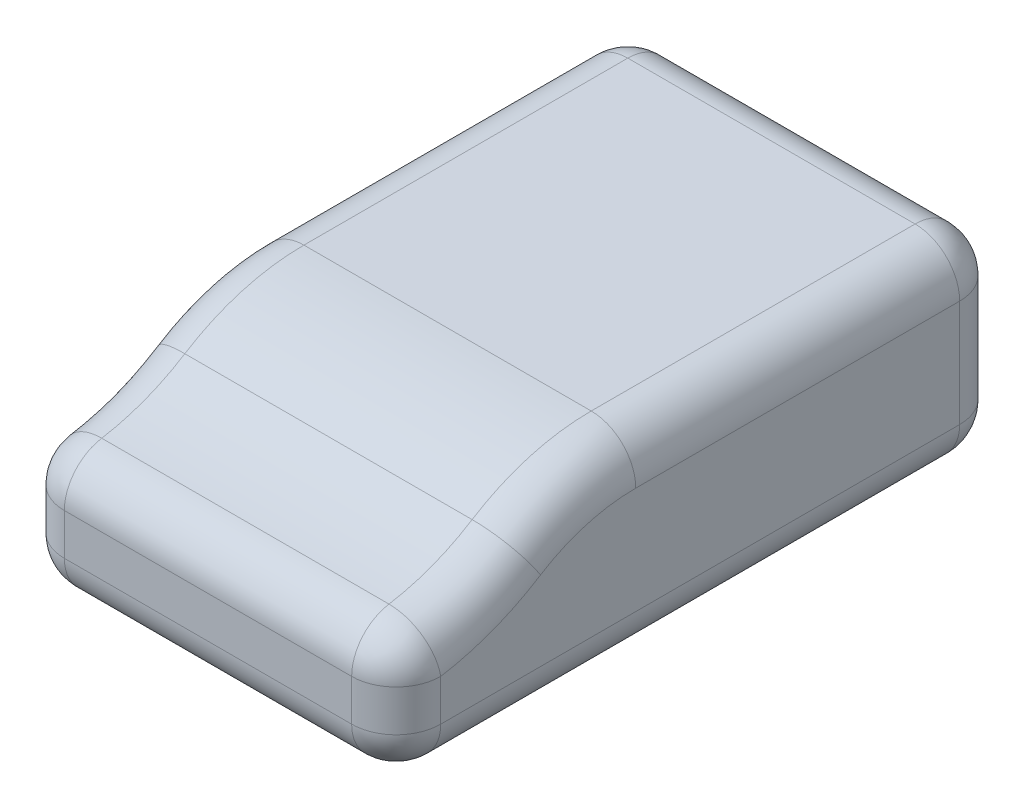
ISO-10303-21;
HEADER;
FILE_DESCRIPTION(('STEP AP214'),'2;1');
FILE_NAME('part.step','',(''),(''),'','','');
FILE_SCHEMA(('AUTOMOTIVE_DESIGN { 1 0 10303 214 1 1 1 1 }'));
ENDSEC;
DATA;
#1=APPLICATION_CONTEXT('core data for automotive mechanical design processes');
#2=APPLICATION_PROTOCOL_DEFINITION('international standard','automotive_design',2000,#1);
#3=PRODUCT_CONTEXT('',#1,'mechanical');
#4=PRODUCT('Part','Part','',(#3));
#5=PRODUCT_RELATED_PRODUCT_CATEGORY('part','',(#4));
#6=PRODUCT_DEFINITION_FORMATION('','',#4);
#7=PRODUCT_DEFINITION_CONTEXT('part definition',#1,'design');
#8=PRODUCT_DEFINITION('design','',#6,#7);
#9=PRODUCT_DEFINITION_SHAPE('','',#8);
#10=(LENGTH_UNIT() NAMED_UNIT(*) SI_UNIT(.MILLI.,.METRE.));
#11=(NAMED_UNIT(*) PLANE_ANGLE_UNIT() SI_UNIT($,.RADIAN.));
#12=(NAMED_UNIT(*) SI_UNIT($,.STERADIAN.) SOLID_ANGLE_UNIT());
#13=UNCERTAINTY_MEASURE_WITH_UNIT(LENGTH_MEASURE(1.E-05),#10,'distance_accuracy_value','');
#14=(GEOMETRIC_REPRESENTATION_CONTEXT(3) GLOBAL_UNCERTAINTY_ASSIGNED_CONTEXT((#13)) GLOBAL_UNIT_ASSIGNED_CONTEXT((#10,
#11,#12)) REPRESENTATION_CONTEXT('',''));
#15=CARTESIAN_POINT('',(0.,0.,0.));
#16=DIRECTION('',(0.,0.,1.));
#17=DIRECTION('',(1.,0.,0.));
#18=AXIS2_PLACEMENT_3D('',#15,#16,#17);
#19=CARTESIAN_POINT('',(8.45,1.3,13.65));
#20=DIRECTION('',(0.,0.,-1.));
#21=DIRECTION('',(-1.,0.,0.));
#22=AXIS2_PLACEMENT_3D('',#19,#20,#21);
#23=PLANE('',#22);
#24=DIRECTION('',(0.,-1.,0.));
#25=VECTOR('',#24,1.);
#26=CARTESIAN_POINT('',(6.45,1.3,13.65));
#27=LINE('',#26,#25);
#28=CARTESIAN_POINT('',(6.45,-2.4,13.65));
#29=VERTEX_POINT('',#28);
#30=CARTESIAN_POINT('',(6.45,-0.542457216295852,13.65));
#31=VERTEX_POINT('',#30);
#32=EDGE_CURVE('E201',#29,#31,#27,.F.);
#33=ORIENTED_EDGE('',*,*,#32,.T.);
#34=DIRECTION('',(-1.,0.,0.));
#35=VECTOR('',#34,1.);
#36=CARTESIAN_POINT('',(8.45,-0.542457216295852,13.65));
#37=LINE('',#36,#35);
#38=CARTESIAN_POINT('',(-6.45,-0.542457216295852,13.65));
#39=VERTEX_POINT('',#38);
#40=EDGE_CURVE('E47',#31,#39,#37,.T.);
#41=ORIENTED_EDGE('',*,*,#40,.T.);
#42=DIRECTION('',(0.,-1.,0.));
#43=VECTOR('',#42,1.);
#44=CARTESIAN_POINT('',(-6.45,1.3,13.65));
#45=LINE('',#44,#43);
#46=CARTESIAN_POINT('',(-6.45,-2.4,13.65));
#47=VERTEX_POINT('',#46);
#48=EDGE_CURVE('E206',#39,#47,#45,.T.);
#49=ORIENTED_EDGE('',*,*,#48,.T.);
#50=DIRECTION('',(-1.,0.,0.));
#51=VECTOR('',#50,1.);
#52=CARTESIAN_POINT('',(8.45,-2.4,13.65));
#53=LINE('',#52,#51);
#54=EDGE_CURVE('E203',#47,#29,#53,.F.);
#55=ORIENTED_EDGE('',*,*,#54,.T.);
#56=EDGE_LOOP('',(#33,#41,#49,#55));
#57=FACE_BOUND('',#56,.T.);
#58=ADVANCED_FACE('F38',(#57),#23,.F.);
#59=CARTESIAN_POINT('',(8.45,-4.4,13.65));
#60=DIRECTION('',(0.,1.,0.));
#61=DIRECTION('',(0.,0.,1.));
#62=AXIS2_PLACEMENT_3D('',#59,#60,#61);
#63=PLANE('',#62);
#64=DIRECTION('',(-1.,0.,0.));
#65=VECTOR('',#64,1.);
#66=CARTESIAN_POINT('',(8.45,-4.4,11.65));
#67=LINE('',#66,#65);
#68=CARTESIAN_POINT('',(6.45,-4.4,11.65));
#69=VERTEX_POINT('',#68);
#70=CARTESIAN_POINT('',(-6.45,-4.4,11.65));
#71=VERTEX_POINT('',#70);
#72=EDGE_CURVE('E165',#69,#71,#67,.T.);
#73=ORIENTED_EDGE('',*,*,#72,.T.);
#74=DIRECTION('',(0.,0.,-1.));
#75=VECTOR('',#74,1.);
#76=CARTESIAN_POINT('',(-6.45,-4.4,13.65));
#77=LINE('',#76,#75);
#78=CARTESIAN_POINT('',(-6.45,-4.4,-11.65));
#79=VERTEX_POINT('',#78);
#80=EDGE_CURVE('E161',#71,#79,#77,.T.);
#81=ORIENTED_EDGE('',*,*,#80,.T.);
#82=DIRECTION('',(-1.,0.,0.));
#83=VECTOR('',#82,1.);
#84=CARTESIAN_POINT('',(8.45,-4.4,-11.65));
#85=LINE('',#84,#83);
#86=CARTESIAN_POINT('',(6.45,-4.4,-11.65));
#87=VERTEX_POINT('',#86);
#88=EDGE_CURVE('E153',#79,#87,#85,.F.);
#89=ORIENTED_EDGE('',*,*,#88,.T.);
#90=DIRECTION('',(0.,0.,-1.));
#91=VECTOR('',#90,1.);
#92=CARTESIAN_POINT('',(6.45,-4.4,13.65));
#93=LINE('',#92,#91);
#94=EDGE_CURVE('E158',#87,#69,#93,.F.);
#95=ORIENTED_EDGE('',*,*,#94,.T.);
#96=EDGE_LOOP('',(#73,#81,#89,#95));
#97=FACE_BOUND('',#96,.T.);
#98=ADVANCED_FACE('F156',(#97),#63,.F.);
#99=CARTESIAN_POINT('',(8.45,-4.4,-13.65));
#100=DIRECTION('',(0.,0.,1.));
#101=DIRECTION('',(1.,0.,0.));
#102=AXIS2_PLACEMENT_3D('',#99,#100,#101);
#103=PLANE('',#102);
#104=DIRECTION('',(-1.,0.,0.));
#105=VECTOR('',#104,1.);
#106=CARTESIAN_POINT('',(8.45,-2.4,-13.65));
#107=LINE('',#106,#105);
#108=CARTESIAN_POINT('',(6.45,-2.4,-13.65));
#109=VERTEX_POINT('',#108);
#110=CARTESIAN_POINT('',(-6.45,-2.4,-13.65));
#111=VERTEX_POINT('',#110);
#112=EDGE_CURVE('E173',#109,#111,#107,.T.);
#113=ORIENTED_EDGE('',*,*,#112,.T.);
#114=DIRECTION('',(0.,1.,0.));
#115=VECTOR('',#114,1.);
#116=CARTESIAN_POINT('',(-6.45,-4.4,-13.65));
#117=LINE('',#116,#115);
#118=CARTESIAN_POINT('',(-6.45,2.4,-13.65));
#119=VERTEX_POINT('',#118);
#120=EDGE_CURVE('E213',#111,#119,#117,.T.);
#121=ORIENTED_EDGE('',*,*,#120,.T.);
#122=DIRECTION('',(-1.,0.,0.));
#123=VECTOR('',#122,1.);
#124=CARTESIAN_POINT('',(8.45,2.4,-13.65));
#125=LINE('',#124,#123);
#126=CARTESIAN_POINT('',(6.45,2.4,-13.65));
#127=VERTEX_POINT('',#126);
#128=EDGE_CURVE('E210',#119,#127,#125,.F.);
#129=ORIENTED_EDGE('',*,*,#128,.T.);
#130=DIRECTION('',(0.,1.,0.));
#131=VECTOR('',#130,1.);
#132=CARTESIAN_POINT('',(6.45,-4.4,-13.65));
#133=LINE('',#132,#131);
#134=EDGE_CURVE('E208',#127,#109,#133,.F.);
#135=ORIENTED_EDGE('',*,*,#134,.T.);
#136=EDGE_LOOP('',(#113,#121,#129,#135));
#137=FACE_BOUND('',#136,.T.);
#138=ADVANCED_FACE('F414',(#137),#103,.F.);
#139=CARTESIAN_POINT('',(8.45,4.4,-13.65));
#140=DIRECTION('',(0.,-1.,0.));
#141=DIRECTION('',(0.,0.,-1.));
#142=AXIS2_PLACEMENT_3D('',#139,#140,#141);
#143=PLANE('',#142);
#144=DIRECTION('',(-1.,0.,0.));
#145=VECTOR('',#144,1.);
#146=CARTESIAN_POINT('',(8.45,4.4,-11.65));
#147=LINE('',#146,#145);
#148=CARTESIAN_POINT('',(6.45,4.4,-11.65));
#149=VERTEX_POINT('',#148);
#150=CARTESIAN_POINT('',(-6.45,4.4,-11.65));
#151=VERTEX_POINT('',#150);
#152=EDGE_CURVE('E217',#149,#151,#147,.T.);
#153=ORIENTED_EDGE('',*,*,#152,.T.);
#154=DIRECTION('',(0.,0.,1.));
#155=VECTOR('',#154,1.);
#156=CARTESIAN_POINT('',(-6.45,4.4,-13.65));
#157=LINE('',#156,#155);
#158=CARTESIAN_POINT('',(-6.45,4.4,2.8927675896935));
#159=VERTEX_POINT('',#158);
#160=EDGE_CURVE('E219',#151,#159,#157,.T.);
#161=ORIENTED_EDGE('',*,*,#160,.T.);
#162=DIRECTION('',(-1.,0.,0.));
#163=VECTOR('',#162,1.);
#164=CARTESIAN_POINT('',(8.45,4.4,2.8927675896935));
#165=LINE('',#164,#163);
#166=CARTESIAN_POINT('',(6.45,4.4,2.8927675896935));
#167=VERTEX_POINT('',#166);
#168=EDGE_CURVE('E192',#159,#167,#165,.F.);
#169=ORIENTED_EDGE('',*,*,#168,.T.);
#170=DIRECTION('',(0.,0.,1.));
#171=VECTOR('',#170,1.);
#172=CARTESIAN_POINT('',(6.45,4.4,-13.65));
#173=LINE('',#172,#171);
#174=EDGE_CURVE('E215',#167,#149,#173,.F.);
#175=ORIENTED_EDGE('',*,*,#174,.T.);
#176=EDGE_LOOP('',(#153,#161,#169,#175));
#177=FACE_BOUND('',#176,.T.);
#178=ADVANCED_FACE('F374',(#177),#143,.F.);
#179=CARTESIAN_POINT('',(8.45,0.,0.));
#180=DIRECTION('',(1.,0.,0.));
#181=DIRECTION('',(0.,0.,-1.));
#182=AXIS2_PLACEMENT_3D('',#179,#180,#181);
#183=PLANE('',#182);
#184=DIRECTION('',(0.,0.,-1.));
#185=VECTOR('',#184,1.);
#186=CARTESIAN_POINT('',(8.45,-2.4,-13.65));
#187=LINE('',#186,#185);
#188=CARTESIAN_POINT('',(8.45,-2.4,11.65));
#189=VERTEX_POINT('',#188);
#190=CARTESIAN_POINT('',(8.45,-2.4,-11.65));
#191=VERTEX_POINT('',#190);
#192=EDGE_CURVE('E251',#189,#191,#187,.T.);
#193=ORIENTED_EDGE('',*,*,#192,.T.);
#194=DIRECTION('',(0.,1.,0.));
#195=VECTOR('',#194,1.);
#196=CARTESIAN_POINT('',(8.45,4.4,-11.65));
#197=LINE('',#196,#195);
#198=CARTESIAN_POINT('',(8.45,2.4,-11.65));
#199=VERTEX_POINT('',#198);
#200=EDGE_CURVE('E253',#191,#199,#197,.T.);
#201=ORIENTED_EDGE('',*,*,#200,.T.);
#202=DIRECTION('',(0.,0.,1.));
#203=VECTOR('',#202,1.);
#204=CARTESIAN_POINT('',(8.45,2.4,2.8927675896935));
#205=LINE('',#204,#203);
#206=CARTESIAN_POINT('',(8.45,2.4,2.8927675896935));
#207=VERTEX_POINT('',#206);
#208=EDGE_CURVE('E242',#199,#207,#205,.T.);
#209=ORIENTED_EDGE('',*,*,#208,.T.);
#210=CARTESIAN_POINT('',(8.45,-5.6,2.8927675896935));
#211=DIRECTION('',(1.,0.,0.));
#212=DIRECTION('',(0.,0.,-1.));
#213=AXIS2_PLACEMENT_3D('',#210,#211,#212);
#214=CIRCLE('',#213,8.);
#215=CARTESIAN_POINT('',(8.45,1.16,7.17089802248771));
#216=VERTEX_POINT('',#215);
#217=EDGE_CURVE('E244',#207,#216,#214,.T.);
#218=ORIENTED_EDGE('',*,*,#217,.T.);
#219=CARTESIAN_POINT('',(8.45,11.3,13.588093671679));
#220=DIRECTION('',(1.,0.,0.));
#221=DIRECTION('',(0.,0.,-1.));
#222=AXIS2_PLACEMENT_3D('',#219,#220,#221);
#223=CIRCLE('',#222,12.);
#224=CARTESIAN_POINT('',(8.45,-0.542457216295854,11.65));
#225=VERTEX_POINT('',#224);
#226=EDGE_CURVE('E246',#216,#225,#223,.F.);
#227=ORIENTED_EDGE('',*,*,#226,.T.);
#228=DIRECTION('',(0.,-1.,0.));
#229=VECTOR('',#228,1.);
#230=CARTESIAN_POINT('',(8.45,-4.4,11.65));
#231=LINE('',#230,#229);
#232=EDGE_CURVE('E249',#225,#189,#231,.T.);
#233=ORIENTED_EDGE('',*,*,#232,.T.);
#234=EDGE_LOOP('',(#193,#201,#209,#218,#227,#233));
#235=FACE_BOUND('',#234,.T.);
#236=ADVANCED_FACE('F358',(#235),#183,.T.);
#237=CARTESIAN_POINT('',(-8.45,0.,0.));
#238=DIRECTION('',(1.,0.,0.));
#239=DIRECTION('',(0.,0.,-1.));
#240=AXIS2_PLACEMENT_3D('',#237,#238,#239);
#241=PLANE('',#240);
#242=DIRECTION('',(0.,0.,-1.));
#243=VECTOR('',#242,1.);
#244=CARTESIAN_POINT('',(-8.45,-2.4,0.));
#245=LINE('',#244,#243);
#246=CARTESIAN_POINT('',(-8.45,-2.4,-11.65));
#247=VERTEX_POINT('',#246);
#248=CARTESIAN_POINT('',(-8.45,-2.4,11.65));
#249=VERTEX_POINT('',#248);
#250=EDGE_CURVE('E229',#247,#249,#245,.F.);
#251=ORIENTED_EDGE('',*,*,#250,.T.);
#252=DIRECTION('',(0.,-1.,0.));
#253=VECTOR('',#252,1.);
#254=CARTESIAN_POINT('',(-8.45,0.,11.65));
#255=LINE('',#254,#253);
#256=CARTESIAN_POINT('',(-8.45,-0.542457216295854,11.65));
#257=VERTEX_POINT('',#256);
#258=EDGE_CURVE('E231',#249,#257,#255,.F.);
#259=ORIENTED_EDGE('',*,*,#258,.T.);
#260=CARTESIAN_POINT('',(-8.45,11.3,13.588093671679));
#261=DIRECTION('',(1.,0.,0.));
#262=DIRECTION('',(0.,0.,-1.));
#263=AXIS2_PLACEMENT_3D('',#260,#261,#262);
#264=CIRCLE('',#263,12.);
#265=CARTESIAN_POINT('',(-8.45,1.16,7.17089802248771));
#266=VERTEX_POINT('',#265);
#267=EDGE_CURVE('E221',#257,#266,#264,.T.);
#268=ORIENTED_EDGE('',*,*,#267,.T.);
#269=CARTESIAN_POINT('',(-8.45,-5.6,2.8927675896935));
#270=DIRECTION('',(1.,0.,0.));
#271=DIRECTION('',(0.,0.,-1.));
#272=AXIS2_PLACEMENT_3D('',#269,#270,#271);
#273=CIRCLE('',#272,8.);
#274=CARTESIAN_POINT('',(-8.45,2.4,2.8927675896935));
#275=VERTEX_POINT('',#274);
#276=EDGE_CURVE('E223',#266,#275,#273,.F.);
#277=ORIENTED_EDGE('',*,*,#276,.T.);
#278=DIRECTION('',(0.,0.,1.));
#279=VECTOR('',#278,1.);
#280=CARTESIAN_POINT('',(-8.45,2.4,0.));
#281=LINE('',#280,#279);
#282=CARTESIAN_POINT('',(-8.45,2.4,-11.65));
#283=VERTEX_POINT('',#282);
#284=EDGE_CURVE('E225',#275,#283,#281,.F.);
#285=ORIENTED_EDGE('',*,*,#284,.T.);
#286=DIRECTION('',(0.,1.,0.));
#287=VECTOR('',#286,1.);
#288=CARTESIAN_POINT('',(-8.45,0.,-11.65));
#289=LINE('',#288,#287);
#290=EDGE_CURVE('E227',#283,#247,#289,.F.);
#291=ORIENTED_EDGE('',*,*,#290,.T.);
#292=EDGE_LOOP('',(#251,#259,#268,#277,#285,#291));
#293=FACE_BOUND('',#292,.T.);
#294=ADVANCED_FACE('F333',(#293),#241,.F.);
#295=CARTESIAN_POINT('',(8.45,11.3,13.588093671679));
#296=DIRECTION('',(-1.,0.,0.));
#297=DIRECTION('',(0.,0.,1.));
#298=AXIS2_PLACEMENT_3D('',#295,#296,#297);
#299=CYLINDRICAL_SURFACE('',#298,10.);
#300=CARTESIAN_POINT('',(-6.45,11.3,13.588093671679));
#301=DIRECTION('',(1.,0.,0.));
#302=DIRECTION('',(0.,0.,-1.));
#303=AXIS2_PLACEMENT_3D('',#300,#301,#302);
#304=CIRCLE('',#303,10.);
#305=CARTESIAN_POINT('',(-6.45,2.85,8.24043063068626));
#306=VERTEX_POINT('',#305);
#307=CARTESIAN_POINT('',(-6.45,1.43128565308679,11.9730156119465));
#308=VERTEX_POINT('',#307);
#309=EDGE_CURVE('E240',#306,#308,#304,.F.);
#310=ORIENTED_EDGE('',*,*,#309,.T.);
#311=DIRECTION('',(-1.,0.,0.));
#312=VECTOR('',#311,1.);
#313=CARTESIAN_POINT('',(8.45,1.43128565308679,11.9730156119465));
#314=LINE('',#313,#312);
#315=CARTESIAN_POINT('',(6.45,1.43128565308679,11.9730156119465));
#316=VERTEX_POINT('',#315);
#317=EDGE_CURVE('E11',#308,#316,#314,.F.);
#318=ORIENTED_EDGE('',*,*,#317,.T.);
#319=CARTESIAN_POINT('',(6.45,11.3,13.588093671679));
#320=DIRECTION('',(1.,0.,0.));
#321=DIRECTION('',(0.,0.,-1.));
#322=AXIS2_PLACEMENT_3D('',#319,#320,#321);
#323=CIRCLE('',#322,10.);
#324=CARTESIAN_POINT('',(6.45,2.85,8.24043063068626));
#325=VERTEX_POINT('',#324);
#326=EDGE_CURVE('E238',#316,#325,#323,.T.);
#327=ORIENTED_EDGE('',*,*,#326,.T.);
#328=DIRECTION('',(-1.,0.,0.));
#329=VECTOR('',#328,1.);
#330=CARTESIAN_POINT('',(8.45,2.85,8.24043063068626));
#331=LINE('',#330,#329);
#332=EDGE_CURVE('E195',#325,#306,#331,.T.);
#333=ORIENTED_EDGE('',*,*,#332,.T.);
#334=EDGE_LOOP('',(#310,#318,#327,#333));
#335=FACE_BOUND('',#334,.T.);
#336=ADVANCED_FACE('F400',(#335),#299,.F.);
#337=CARTESIAN_POINT('',(8.45,-5.6,2.8927675896935));
#338=DIRECTION('',(-1.,0.,0.));
#339=DIRECTION('',(0.,0.,1.));
#340=AXIS2_PLACEMENT_3D('',#337,#338,#339);
#341=CYLINDRICAL_SURFACE('',#340,10.);
#342=ORIENTED_EDGE('',*,*,#168,.F.);
#343=CARTESIAN_POINT('',(-6.45,-5.6,2.8927675896935));
#344=DIRECTION('',(1.,0.,0.));
#345=DIRECTION('',(0.,0.,-1.));
#346=AXIS2_PLACEMENT_3D('',#343,#344,#345);
#347=CIRCLE('',#346,10.);
#348=EDGE_CURVE('E236',#159,#306,#347,.T.);
#349=ORIENTED_EDGE('',*,*,#348,.T.);
#350=ORIENTED_EDGE('',*,*,#332,.F.);
#351=CARTESIAN_POINT('',(6.45,-5.6,2.8927675896935));
#352=DIRECTION('',(1.,0.,0.));
#353=DIRECTION('',(0.,0.,-1.));
#354=AXIS2_PLACEMENT_3D('',#351,#352,#353);
#355=CIRCLE('',#354,10.);
#356=EDGE_CURVE('E234',#325,#167,#355,.F.);
#357=ORIENTED_EDGE('',*,*,#356,.T.);
#358=EDGE_LOOP('',(#342,#349,#350,#357));
#359=FACE_BOUND('',#358,.T.);
#360=ADVANCED_FACE('F369',(#359),#341,.T.);
#361=CARTESIAN_POINT('',(8.45,2.4,-11.65));
#362=DIRECTION('',(-1.,0.,0.));
#363=DIRECTION('',(0.,0.,1.));
#364=AXIS2_PLACEMENT_3D('',#361,#362,#363);
#365=CYLINDRICAL_SURFACE('',#364,2.);
#366=CARTESIAN_POINT('',(-6.45,2.4,-11.65));
#367=DIRECTION('',(-1.,0.,0.));
#368=DIRECTION('',(0.,0.,1.));
#369=AXIS2_PLACEMENT_3D('',#366,#367,#368);
#370=CIRCLE('',#369,2.);
#371=EDGE_CURVE('E296',#151,#119,#370,.T.);
#372=ORIENTED_EDGE('',*,*,#371,.F.);
#373=ORIENTED_EDGE('',*,*,#152,.F.);
#374=CARTESIAN_POINT('',(6.45,2.4,-11.65));
#375=DIRECTION('',(1.,0.,0.));
#376=DIRECTION('',(0.,0.,-1.));
#377=AXIS2_PLACEMENT_3D('',#374,#375,#376);
#378=CIRCLE('',#377,2.);
#379=EDGE_CURVE('E299',#127,#149,#378,.T.);
#380=ORIENTED_EDGE('',*,*,#379,.F.);
#381=ORIENTED_EDGE('',*,*,#128,.F.);
#382=EDGE_LOOP('',(#372,#373,#380,#381));
#383=FACE_BOUND('',#382,.T.);
#384=ADVANCED_FACE('F388',(#383),#365,.T.);
#385=CARTESIAN_POINT('',(6.45,2.4,0.));
#386=DIRECTION('',(0.,0.,-1.));
#387=DIRECTION('',(0.,1.,0.));
#388=AXIS2_PLACEMENT_3D('',#385,#386,#387);
#389=CYLINDRICAL_SURFACE('',#388,2.);
#390=CARTESIAN_POINT('',(6.45,2.4,-11.65));
#391=DIRECTION('',(0.,0.,-1.));
#392=DIRECTION('',(-1.,0.,0.));
#393=AXIS2_PLACEMENT_3D('',#390,#391,#392);
#394=CIRCLE('',#393,2.);
#395=EDGE_CURVE('E302',#149,#199,#394,.T.);
#396=ORIENTED_EDGE('',*,*,#395,.F.);
#397=ORIENTED_EDGE('',*,*,#174,.F.);
#398=CARTESIAN_POINT('',(6.45,2.4,2.8927675896935));
#399=DIRECTION('',(0.,0.,1.));
#400=DIRECTION('',(0.,-1.,0.));
#401=AXIS2_PLACEMENT_3D('',#398,#399,#400);
#402=CIRCLE('',#401,2.);
#403=EDGE_CURVE('E290',#207,#167,#402,.T.);
#404=ORIENTED_EDGE('',*,*,#403,.F.);
#405=ORIENTED_EDGE('',*,*,#208,.F.);
#406=EDGE_LOOP('',(#396,#397,#404,#405));
#407=FACE_BOUND('',#406,.T.);
#408=ADVANCED_FACE('F379',(#407),#389,.T.);
#409=CARTESIAN_POINT('',(6.45,2.4,-11.65));
#410=DIRECTION('',(0.,0.,1.));
#411=DIRECTION('',(1.,0.,0.));
#412=AXIS2_PLACEMENT_3D('',#409,#410,#411);
#413=SPHERICAL_SURFACE('',#412,2.);
#414=ORIENTED_EDGE('',*,*,#379,.T.);
#415=ORIENTED_EDGE('',*,*,#395,.T.);
#416=CARTESIAN_POINT('',(6.45,2.4,-11.65));
#417=DIRECTION('',(0.,1.,0.));
#418=DIRECTION('',(0.,0.,1.));
#419=AXIS2_PLACEMENT_3D('',#416,#417,#418);
#420=CIRCLE('',#419,2.);
#421=EDGE_CURVE('E288',#127,#199,#420,.F.);
#422=ORIENTED_EDGE('',*,*,#421,.F.);
#423=EDGE_LOOP('',(#414,#415,#422));
#424=FACE_BOUND('',#423,.T.);
#425=ADVANCED_FACE('F383',(#424),#413,.T.);
#426=CARTESIAN_POINT('',(-6.45,2.4,-11.65));
#427=DIRECTION('',(0.,0.,1.));
#428=DIRECTION('',(1.,0.,0.));
#429=AXIS2_PLACEMENT_3D('',#426,#427,#428);
#430=SPHERICAL_SURFACE('',#429,2.);
#431=CARTESIAN_POINT('',(-6.45,2.4,-11.65));
#432=DIRECTION('',(0.,1.,0.));
#433=DIRECTION('',(0.,0.,1.));
#434=AXIS2_PLACEMENT_3D('',#431,#432,#433);
#435=CIRCLE('',#434,2.);
#436=EDGE_CURVE('E285',#283,#119,#435,.F.);
#437=ORIENTED_EDGE('',*,*,#436,.F.);
#438=CARTESIAN_POINT('',(-6.45,2.4,-11.65));
#439=DIRECTION('',(0.,0.,-1.));
#440=DIRECTION('',(-1.,0.,0.));
#441=AXIS2_PLACEMENT_3D('',#438,#439,#440);
#442=CIRCLE('',#441,2.);
#443=EDGE_CURVE('E293',#151,#283,#442,.F.);
#444=ORIENTED_EDGE('',*,*,#443,.F.);
#445=ORIENTED_EDGE('',*,*,#371,.T.);
#446=EDGE_LOOP('',(#437,#444,#445));
#447=FACE_BOUND('',#446,.T.);
#448=ADVANCED_FACE('F392',(#447),#430,.T.);
#449=CARTESIAN_POINT('',(-6.45,2.4,-13.65));
#450=DIRECTION('',(0.,0.,1.));
#451=DIRECTION('',(0.,-1.,0.));
#452=AXIS2_PLACEMENT_3D('',#449,#450,#451);
#453=CYLINDRICAL_SURFACE('',#452,2.);
#454=ORIENTED_EDGE('',*,*,#443,.T.);
#455=ORIENTED_EDGE('',*,*,#284,.F.);
#456=CARTESIAN_POINT('',(-6.45,2.4,2.8927675896935));
#457=DIRECTION('',(0.,0.,1.));
#458=DIRECTION('',(0.,-1.,0.));
#459=AXIS2_PLACEMENT_3D('',#456,#457,#458);
#460=CIRCLE('',#459,2.);
#461=EDGE_CURVE('E282',#159,#275,#460,.T.);
#462=ORIENTED_EDGE('',*,*,#461,.F.);
#463=ORIENTED_EDGE('',*,*,#160,.F.);
#464=EDGE_LOOP('',(#454,#455,#462,#463));
#465=FACE_BOUND('',#464,.T.);
#466=ADVANCED_FACE('F395',(#465),#453,.T.);
#467=CARTESIAN_POINT('',(6.45,-5.6,2.8927675896935));
#468=DIRECTION('',(1.,0.,0.));
#469=DIRECTION('',(0.,0.,-1.));
#470=AXIS2_PLACEMENT_3D('',#467,#468,#469);
#471=TOROIDAL_SURFACE('',#470,8.,2.);
#472=ORIENTED_EDGE('',*,*,#403,.T.);
#473=ORIENTED_EDGE('',*,*,#356,.F.);
#474=CARTESIAN_POINT('',(6.45,1.16,7.17089802248771));
#475=DIRECTION('',(0.,-0.534766304099277,0.845));
#476=DIRECTION('',(0.,-0.845,-0.534766304099277));
#477=AXIS2_PLACEMENT_3D('',#474,#475,#476);
#478=CIRCLE('',#477,2.);
#479=EDGE_CURVE('E279',#216,#325,#478,.T.);
#480=ORIENTED_EDGE('',*,*,#479,.F.);
#481=ORIENTED_EDGE('',*,*,#217,.F.);
#482=EDGE_LOOP('',(#472,#473,#480,#481));
#483=FACE_BOUND('',#482,.T.);
#484=ADVANCED_FACE('F365',(#483),#471,.T.);
#485=CARTESIAN_POINT('',(6.45,0.,-11.65));
#486=DIRECTION('',(0.,-1.,0.));
#487=DIRECTION('',(0.,0.,-1.));
#488=AXIS2_PLACEMENT_3D('',#485,#486,#487);
#489=CYLINDRICAL_SURFACE('',#488,2.);
#490=ORIENTED_EDGE('',*,*,#421,.T.);
#491=ORIENTED_EDGE('',*,*,#200,.F.);
#492=CARTESIAN_POINT('',(6.45,-2.4,-11.65));
#493=DIRECTION('',(0.,-1.,0.));
#494=DIRECTION('',(0.,0.,-1.));
#495=AXIS2_PLACEMENT_3D('',#492,#493,#494);
#496=CIRCLE('',#495,2.);
#497=EDGE_CURVE('E177',#109,#191,#496,.T.);
#498=ORIENTED_EDGE('',*,*,#497,.F.);
#499=ORIENTED_EDGE('',*,*,#134,.F.);
#500=EDGE_LOOP('',(#490,#491,#498,#499));
#501=FACE_BOUND('',#500,.T.);
#502=ADVANCED_FACE('F520',(#501),#489,.T.);
#503=CARTESIAN_POINT('',(8.45,-2.4,-11.65));
#504=DIRECTION('',(-1.,0.,0.));
#505=DIRECTION('',(0.,0.,1.));
#506=AXIS2_PLACEMENT_3D('',#503,#504,#505);
#507=CYLINDRICAL_SURFACE('',#506,2.);
#508=CARTESIAN_POINT('',(-6.45,-2.4,-11.65));
#509=DIRECTION('',(-1.,0.,0.));
#510=DIRECTION('',(0.,0.,1.));
#511=AXIS2_PLACEMENT_3D('',#508,#509,#510);
#512=CIRCLE('',#511,2.);
#513=EDGE_CURVE('E178',#111,#79,#512,.T.);
#514=ORIENTED_EDGE('',*,*,#513,.F.);
#515=ORIENTED_EDGE('',*,*,#112,.F.);
#516=CARTESIAN_POINT('',(6.45,-2.4,-11.65));
#517=DIRECTION('',(1.,0.,0.));
#518=DIRECTION('',(0.,0.,-1.));
#519=AXIS2_PLACEMENT_3D('',#516,#517,#518);
#520=CIRCLE('',#519,2.);
#521=EDGE_CURVE('E169',#87,#109,#520,.T.);
#522=ORIENTED_EDGE('',*,*,#521,.F.);
#523=ORIENTED_EDGE('',*,*,#88,.F.);
#524=EDGE_LOOP('',(#514,#515,#522,#523));
#525=FACE_BOUND('',#524,.T.);
#526=ADVANCED_FACE('F171',(#525),#507,.T.);
#527=CARTESIAN_POINT('',(-6.45,-4.4,-11.65));
#528=DIRECTION('',(0.,1.,0.));
#529=DIRECTION('',(0.,0.,1.));
#530=AXIS2_PLACEMENT_3D('',#527,#528,#529);
#531=CYLINDRICAL_SURFACE('',#530,2.);
#532=ORIENTED_EDGE('',*,*,#436,.T.);
#533=ORIENTED_EDGE('',*,*,#120,.F.);
#534=CARTESIAN_POINT('',(-6.45,-2.4,-11.65));
#535=DIRECTION('',(0.,-1.,0.));
#536=DIRECTION('',(0.,0.,-1.));
#537=AXIS2_PLACEMENT_3D('',#534,#535,#536);
#538=CIRCLE('',#537,2.);
#539=EDGE_CURVE('E275',#247,#111,#538,.T.);
#540=ORIENTED_EDGE('',*,*,#539,.F.);
#541=ORIENTED_EDGE('',*,*,#290,.F.);
#542=EDGE_LOOP('',(#532,#533,#540,#541));
#543=FACE_BOUND('',#542,.T.);
#544=ADVANCED_FACE('F531',(#543),#531,.T.);
#545=CARTESIAN_POINT('',(-6.45,-5.6,2.8927675896935));
#546=DIRECTION('',(1.,0.,0.));
#547=DIRECTION('',(0.,0.,-1.));
#548=AXIS2_PLACEMENT_3D('',#545,#546,#547);
#549=TOROIDAL_SURFACE('',#548,8.,2.);
#550=ORIENTED_EDGE('',*,*,#461,.T.);
#551=ORIENTED_EDGE('',*,*,#276,.F.);
#552=CARTESIAN_POINT('',(-6.45,1.16,7.17089802248771));
#553=DIRECTION('',(0.,-0.534766304099277,0.845));
#554=DIRECTION('',(0.,-0.845,-0.534766304099277));
#555=AXIS2_PLACEMENT_3D('',#552,#553,#554);
#556=CIRCLE('',#555,2.);
#557=EDGE_CURVE('E185',#306,#266,#556,.T.);
#558=ORIENTED_EDGE('',*,*,#557,.F.);
#559=ORIENTED_EDGE('',*,*,#348,.F.);
#560=EDGE_LOOP('',(#550,#551,#558,#559));
#561=FACE_BOUND('',#560,.T.);
#562=ADVANCED_FACE('F398',(#561),#549,.T.);
#563=CARTESIAN_POINT('',(6.45,11.3,13.588093671679));
#564=DIRECTION('',(1.,0.,0.));
#565=DIRECTION('',(0.,0.,-1.));
#566=AXIS2_PLACEMENT_3D('',#563,#564,#565);
#567=TOROIDAL_SURFACE('',#566,12.,2.);
#568=ORIENTED_EDGE('',*,*,#326,.F.);
#569=CARTESIAN_POINT('',(6.45,-0.542457216295854,11.65));
#570=DIRECTION('',(0.,0.161507805973252,-0.986871434691321));
#571=DIRECTION('',(0.,0.986871434691321,0.161507805973252));
#572=AXIS2_PLACEMENT_3D('',#569,#570,#571);
#573=CIRCLE('',#572,2.);
#574=EDGE_CURVE('E307',#316,#225,#573,.T.);
#575=ORIENTED_EDGE('',*,*,#574,.T.);
#576=ORIENTED_EDGE('',*,*,#226,.F.);
#577=ORIENTED_EDGE('',*,*,#479,.T.);
#578=EDGE_LOOP('',(#568,#575,#576,#577));
#579=FACE_BOUND('',#578,.T.);
#580=ADVANCED_FACE('F356',(#579),#567,.T.);
#581=CARTESIAN_POINT('',(6.45,-2.4,-11.65));
#582=DIRECTION('',(0.,0.,1.));
#583=DIRECTION('',(1.,0.,0.));
#584=AXIS2_PLACEMENT_3D('',#581,#582,#583);
#585=SPHERICAL_SURFACE('',#584,2.);
#586=ORIENTED_EDGE('',*,*,#521,.T.);
#587=ORIENTED_EDGE('',*,*,#497,.T.);
#588=CARTESIAN_POINT('',(6.45,-2.4,-11.65));
#589=DIRECTION('',(0.,0.,-1.));
#590=DIRECTION('',(-1.,0.,0.));
#591=AXIS2_PLACEMENT_3D('',#588,#589,#590);
#592=CIRCLE('',#591,2.);
#593=EDGE_CURVE('E181',#87,#191,#592,.F.);
#594=ORIENTED_EDGE('',*,*,#593,.F.);
#595=EDGE_LOOP('',(#586,#587,#594));
#596=FACE_BOUND('',#595,.T.);
#597=ADVANCED_FACE('F182',(#596),#585,.T.);
#598=CARTESIAN_POINT('',(-6.45,-2.4,-11.65));
#599=DIRECTION('',(0.,0.,1.));
#600=DIRECTION('',(1.,0.,0.));
#601=AXIS2_PLACEMENT_3D('',#598,#599,#600);
#602=SPHERICAL_SURFACE('',#601,2.);
#603=ORIENTED_EDGE('',*,*,#539,.T.);
#604=ORIENTED_EDGE('',*,*,#513,.T.);
#605=CARTESIAN_POINT('',(-6.45,-2.4,-11.65));
#606=DIRECTION('',(0.,0.,-1.));
#607=DIRECTION('',(-1.,0.,0.));
#608=AXIS2_PLACEMENT_3D('',#605,#606,#607);
#609=CIRCLE('',#608,2.);
#610=EDGE_CURVE('E186',#247,#79,#609,.F.);
#611=ORIENTED_EDGE('',*,*,#610,.F.);
#612=EDGE_LOOP('',(#603,#604,#611));
#613=FACE_BOUND('',#612,.T.);
#614=ADVANCED_FACE('F458',(#613),#602,.T.);
#615=CARTESIAN_POINT('',(-6.45,11.3,13.588093671679));
#616=DIRECTION('',(1.,0.,0.));
#617=DIRECTION('',(0.,0.,-1.));
#618=AXIS2_PLACEMENT_3D('',#615,#616,#617);
#619=TOROIDAL_SURFACE('',#618,12.,2.);
#620=ORIENTED_EDGE('',*,*,#267,.F.);
#621=CARTESIAN_POINT('',(-6.45,-0.542457216295854,11.65));
#622=DIRECTION('',(0.,0.161507805973252,-0.986871434691321));
#623=DIRECTION('',(0.,0.986871434691321,0.161507805973252));
#624=AXIS2_PLACEMENT_3D('',#621,#622,#623);
#625=CIRCLE('',#624,2.);
#626=EDGE_CURVE('E55',#257,#308,#625,.T.);
#627=ORIENTED_EDGE('',*,*,#626,.T.);
#628=ORIENTED_EDGE('',*,*,#309,.F.);
#629=ORIENTED_EDGE('',*,*,#557,.T.);
#630=EDGE_LOOP('',(#620,#627,#628,#629));
#631=FACE_BOUND('',#630,.T.);
#632=ADVANCED_FACE('F329',(#631),#619,.T.);
#633=CARTESIAN_POINT('',(6.45,0.,11.65));
#634=DIRECTION('',(0.,1.,0.));
#635=DIRECTION('',(0.,0.,1.));
#636=AXIS2_PLACEMENT_3D('',#633,#634,#635);
#637=CYLINDRICAL_SURFACE('',#636,2.);
#638=ORIENTED_EDGE('',*,*,#232,.F.);
#639=CARTESIAN_POINT('',(6.45,-0.542457216295852,11.65));
#640=DIRECTION('',(0.,1.,0.));
#641=DIRECTION('',(0.,0.,1.));
#642=AXIS2_PLACEMENT_3D('',#639,#640,#641);
#643=CIRCLE('',#642,2.);
#644=EDGE_CURVE('E256',#225,#31,#643,.F.);
#645=ORIENTED_EDGE('',*,*,#644,.T.);
#646=ORIENTED_EDGE('',*,*,#32,.F.);
#647=CARTESIAN_POINT('',(6.45,-2.4,11.65));
#648=DIRECTION('',(0.,-1.,0.));
#649=DIRECTION('',(0.,0.,-1.));
#650=AXIS2_PLACEMENT_3D('',#647,#648,#649);
#651=CIRCLE('',#650,2.);
#652=EDGE_CURVE('E268',#189,#29,#651,.T.);
#653=ORIENTED_EDGE('',*,*,#652,.F.);
#654=EDGE_LOOP('',(#638,#645,#646,#653));
#655=FACE_BOUND('',#654,.T.);
#656=ADVANCED_FACE('F351',(#655),#637,.T.);
#657=CARTESIAN_POINT('',(6.45,-2.4,0.));
#658=DIRECTION('',(0.,0.,1.));
#659=DIRECTION('',(1.,0.,0.));
#660=AXIS2_PLACEMENT_3D('',#657,#658,#659);
#661=CYLINDRICAL_SURFACE('',#660,2.);
#662=ORIENTED_EDGE('',*,*,#593,.T.);
#663=ORIENTED_EDGE('',*,*,#192,.F.);
#664=CARTESIAN_POINT('',(6.45,-2.4,11.65));
#665=DIRECTION('',(0.,0.,1.));
#666=DIRECTION('',(1.,0.,0.));
#667=AXIS2_PLACEMENT_3D('',#664,#665,#666);
#668=CIRCLE('',#667,2.);
#669=EDGE_CURVE('E190',#69,#189,#668,.T.);
#670=ORIENTED_EDGE('',*,*,#669,.F.);
#671=ORIENTED_EDGE('',*,*,#94,.F.);
#672=EDGE_LOOP('',(#662,#663,#670,#671));
#673=FACE_BOUND('',#672,.T.);
#674=ADVANCED_FACE('F188',(#673),#661,.T.);
#675=CARTESIAN_POINT('',(-6.45,-2.4,13.65));
#676=DIRECTION('',(0.,0.,-1.));
#677=DIRECTION('',(-1.,0.,0.));
#678=AXIS2_PLACEMENT_3D('',#675,#676,#677);
#679=CYLINDRICAL_SURFACE('',#678,2.);
#680=ORIENTED_EDGE('',*,*,#610,.T.);
#681=ORIENTED_EDGE('',*,*,#80,.F.);
#682=CARTESIAN_POINT('',(-6.45,-2.4,11.65));
#683=DIRECTION('',(0.,0.,1.));
#684=DIRECTION('',(1.,0.,0.));
#685=AXIS2_PLACEMENT_3D('',#682,#683,#684);
#686=CIRCLE('',#685,2.);
#687=EDGE_CURVE('E264',#249,#71,#686,.T.);
#688=ORIENTED_EDGE('',*,*,#687,.F.);
#689=ORIENTED_EDGE('',*,*,#250,.F.);
#690=EDGE_LOOP('',(#680,#681,#688,#689));
#691=FACE_BOUND('',#690,.T.);
#692=ADVANCED_FACE('F338',(#691),#679,.T.);
#693=CARTESIAN_POINT('',(-6.45,1.3,11.65));
#694=DIRECTION('',(0.,-1.,0.));
#695=DIRECTION('',(0.,0.,-1.));
#696=AXIS2_PLACEMENT_3D('',#693,#694,#695);
#697=CYLINDRICAL_SURFACE('',#696,2.);
#698=ORIENTED_EDGE('',*,*,#48,.F.);
#699=CARTESIAN_POINT('',(-6.45,-0.542457216295852,11.65));
#700=DIRECTION('',(0.,-1.,0.));
#701=DIRECTION('',(0.,0.,-1.));
#702=AXIS2_PLACEMENT_3D('',#699,#700,#701);
#703=CIRCLE('',#702,2.);
#704=EDGE_CURVE('E309',#39,#257,#703,.T.);
#705=ORIENTED_EDGE('',*,*,#704,.T.);
#706=ORIENTED_EDGE('',*,*,#258,.F.);
#707=CARTESIAN_POINT('',(-6.45,-2.4,11.65));
#708=DIRECTION('',(0.,-1.,0.));
#709=DIRECTION('',(0.,0.,-1.));
#710=AXIS2_PLACEMENT_3D('',#707,#708,#709);
#711=CIRCLE('',#710,2.);
#712=EDGE_CURVE('E261',#47,#249,#711,.T.);
#713=ORIENTED_EDGE('',*,*,#712,.F.);
#714=EDGE_LOOP('',(#698,#705,#706,#713));
#715=FACE_BOUND('',#714,.T.);
#716=ADVANCED_FACE('F326',(#715),#697,.T.);
#717=CARTESIAN_POINT('',(6.45,-2.4,11.65));
#718=DIRECTION('',(0.,0.,1.));
#719=DIRECTION('',(1.,0.,0.));
#720=AXIS2_PLACEMENT_3D('',#717,#718,#719);
#721=SPHERICAL_SURFACE('',#720,2.);
#722=ORIENTED_EDGE('',*,*,#669,.T.);
#723=ORIENTED_EDGE('',*,*,#652,.T.);
#724=CARTESIAN_POINT('',(6.45,-2.4,11.65));
#725=DIRECTION('',(1.,0.,0.));
#726=DIRECTION('',(0.,0.,-1.));
#727=AXIS2_PLACEMENT_3D('',#724,#725,#726);
#728=CIRCLE('',#727,2.);
#729=EDGE_CURVE('E259',#69,#29,#728,.F.);
#730=ORIENTED_EDGE('',*,*,#729,.F.);
#731=EDGE_LOOP('',(#722,#723,#730));
#732=FACE_BOUND('',#731,.T.);
#733=ADVANCED_FACE('F480',(#732),#721,.T.);
#734=CARTESIAN_POINT('',(-6.45,-2.4,11.65));
#735=DIRECTION('',(0.,0.,1.));
#736=DIRECTION('',(1.,0.,0.));
#737=AXIS2_PLACEMENT_3D('',#734,#735,#736);
#738=SPHERICAL_SURFACE('',#737,2.);
#739=ORIENTED_EDGE('',*,*,#712,.T.);
#740=ORIENTED_EDGE('',*,*,#687,.T.);
#741=CARTESIAN_POINT('',(-6.45,-2.4,11.65));
#742=DIRECTION('',(-1.,0.,0.));
#743=DIRECTION('',(0.,0.,1.));
#744=AXIS2_PLACEMENT_3D('',#741,#742,#743);
#745=CIRCLE('',#744,2.);
#746=EDGE_CURVE('E257',#47,#71,#745,.F.);
#747=ORIENTED_EDGE('',*,*,#746,.F.);
#748=EDGE_LOOP('',(#739,#740,#747));
#749=FACE_BOUND('',#748,.T.);
#750=ADVANCED_FACE('F342',(#749),#738,.T.);
#751=CARTESIAN_POINT('',(8.45,-2.4,11.65));
#752=DIRECTION('',(-1.,0.,0.));
#753=DIRECTION('',(0.,0.,1.));
#754=AXIS2_PLACEMENT_3D('',#751,#752,#753);
#755=CYLINDRICAL_SURFACE('',#754,2.);
#756=ORIENTED_EDGE('',*,*,#729,.T.);
#757=ORIENTED_EDGE('',*,*,#54,.F.);
#758=ORIENTED_EDGE('',*,*,#746,.T.);
#759=ORIENTED_EDGE('',*,*,#72,.F.);
#760=EDGE_LOOP('',(#756,#757,#758,#759));
#761=FACE_BOUND('',#760,.T.);
#762=ADVANCED_FACE('F345',(#761),#755,.T.);
#763=CARTESIAN_POINT('',(-6.45,-0.542457216295852,11.65));
#764=DIRECTION('',(0.,0.,1.));
#765=DIRECTION('',(1.,0.,0.));
#766=AXIS2_PLACEMENT_3D('',#763,#764,#765);
#767=SPHERICAL_SURFACE('',#766,2.);
#768=ORIENTED_EDGE('',*,*,#626,.F.);
#769=ORIENTED_EDGE('',*,*,#704,.F.);
#770=CARTESIAN_POINT('',(-6.45,-0.542457216295852,11.65));
#771=DIRECTION('',(1.,0.,0.));
#772=DIRECTION('',(0.,0.,-1.));
#773=AXIS2_PLACEMENT_3D('',#770,#771,#772);
#774=CIRCLE('',#773,2.);
#775=EDGE_CURVE('E42',#308,#39,#774,.T.);
#776=ORIENTED_EDGE('',*,*,#775,.F.);
#777=EDGE_LOOP('',(#768,#769,#776));
#778=FACE_BOUND('',#777,.T.);
#779=ADVANCED_FACE('F40',(#778),#767,.T.);
#780=CARTESIAN_POINT('',(8.45,-0.542457216295852,11.65));
#781=DIRECTION('',(-1.,0.,0.));
#782=DIRECTION('',(0.,0.,1.));
#783=AXIS2_PLACEMENT_3D('',#780,#781,#782);
#784=CYLINDRICAL_SURFACE('',#783,2.);
#785=ORIENTED_EDGE('',*,*,#775,.T.);
#786=ORIENTED_EDGE('',*,*,#40,.F.);
#787=CARTESIAN_POINT('',(6.45,-0.542457216295853,11.65));
#788=DIRECTION('',(1.,0.,0.));
#789=DIRECTION('',(0.,0.,-1.));
#790=AXIS2_PLACEMENT_3D('',#787,#788,#789);
#791=CIRCLE('',#790,2.);
#792=EDGE_CURVE('E312',#316,#31,#791,.T.);
#793=ORIENTED_EDGE('',*,*,#792,.F.);
#794=ORIENTED_EDGE('',*,*,#317,.F.);
#795=EDGE_LOOP('',(#785,#786,#793,#794));
#796=FACE_BOUND('',#795,.T.);
#797=ADVANCED_FACE('F321',(#796),#784,.T.);
#798=CARTESIAN_POINT('',(6.45,-0.542457216295852,11.65));
#799=DIRECTION('',(0.,0.,1.));
#800=DIRECTION('',(1.,0.,0.));
#801=AXIS2_PLACEMENT_3D('',#798,#799,#800);
#802=SPHERICAL_SURFACE('',#801,2.);
#803=ORIENTED_EDGE('',*,*,#644,.F.);
#804=ORIENTED_EDGE('',*,*,#574,.F.);
#805=ORIENTED_EDGE('',*,*,#792,.T.);
#806=EDGE_LOOP('',(#803,#804,#805));
#807=FACE_BOUND('',#806,.T.);
#808=ADVANCED_FACE('F352',(#807),#802,.T.);
#809=CLOSED_SHELL('',(#58,#98,#138,#178,#236,#294,#336,#360,#384,#408,#425,#448,#466,#484,#502,
#526,#544,#562,#580,#597,#614,#632,#656,#674,#692,#716,#733,#750,#762,#779,#797,#808));
#810=MANIFOLD_SOLID_BREP('B2',#809);
#811=ADVANCED_BREP_SHAPE_REPRESENTATION('',(#18,#810),#14);
#812=SHAPE_DEFINITION_REPRESENTATION(#9,#811);
ENDSEC;
END-ISO-10303-21;
